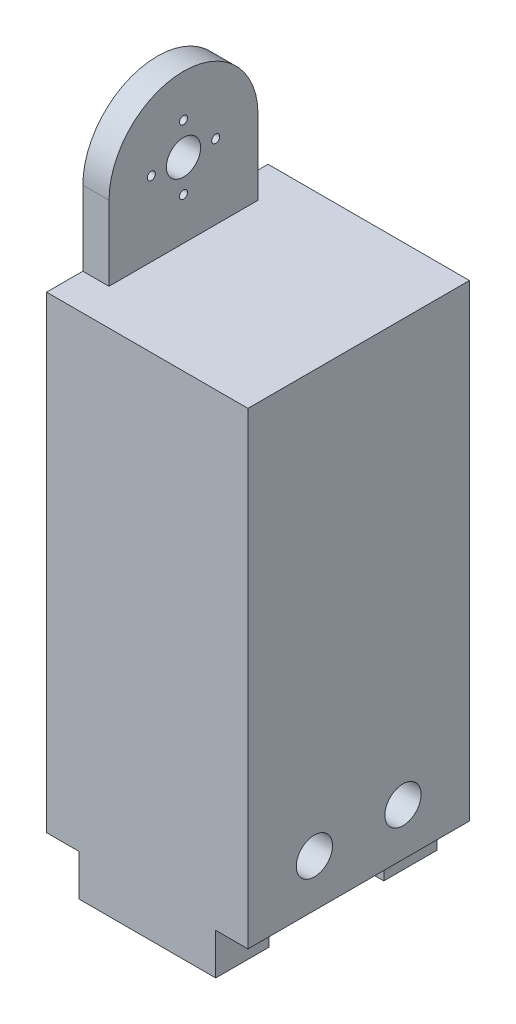
ISO-10303-21;
HEADER;
FILE_DESCRIPTION(('STEP AP214'),'2;1');
FILE_NAME('part.step','',(''),(''),'','','');
FILE_SCHEMA(('AUTOMOTIVE_DESIGN { 1 0 10303 214 1 1 1 1 }'));
ENDSEC;
DATA;
#1=APPLICATION_CONTEXT('core data for automotive mechanical design processes');
#2=APPLICATION_PROTOCOL_DEFINITION('international standard','automotive_design',2000,#1);
#3=PRODUCT_CONTEXT('',#1,'mechanical');
#4=PRODUCT('Part','Part','',(#3));
#5=PRODUCT_RELATED_PRODUCT_CATEGORY('part','',(#4));
#6=PRODUCT_DEFINITION_FORMATION('','',#4);
#7=PRODUCT_DEFINITION_CONTEXT('part definition',#1,'design');
#8=PRODUCT_DEFINITION('design','',#6,#7);
#9=PRODUCT_DEFINITION_SHAPE('','',#8);
#10=(LENGTH_UNIT() NAMED_UNIT(*) SI_UNIT(.MILLI.,.METRE.));
#11=(NAMED_UNIT(*) PLANE_ANGLE_UNIT() SI_UNIT($,.RADIAN.));
#12=(NAMED_UNIT(*) SI_UNIT($,.STERADIAN.) SOLID_ANGLE_UNIT());
#13=UNCERTAINTY_MEASURE_WITH_UNIT(LENGTH_MEASURE(1.E-05),#10,'distance_accuracy_value','');
#14=(GEOMETRIC_REPRESENTATION_CONTEXT(3) GLOBAL_UNCERTAINTY_ASSIGNED_CONTEXT((#13)) GLOBAL_UNIT_ASSIGNED_CONTEXT((#10,
#11,#12)) REPRESENTATION_CONTEXT('',''));
#15=CARTESIAN_POINT('',(0.,0.,0.));
#16=DIRECTION('',(0.,0.,1.));
#17=DIRECTION('',(1.,0.,0.));
#18=AXIS2_PLACEMENT_3D('',#15,#16,#17);
#19=CARTESIAN_POINT('',(-17.,-148.,-38.5));
#20=DIRECTION('',(-1.,0.,0.));
#21=DIRECTION('',(0.,1.,0.));
#22=AXIS2_PLACEMENT_3D('',#19,#20,#21);
#23=PLANE('',#22);
#24=CARTESIAN_POINT('',(-17.,-148.,-38.5));
#25=DIRECTION('',(1.,0.,0.));
#26=DIRECTION('',(0.,1.,0.));
#27=AXIS2_PLACEMENT_3D('',#24,#25,#26);
#28=CIRCLE('',#27,4.5);
#29=CARTESIAN_POINT('',(-17.,-151.112474899497,-41.75));
#30=VERTEX_POINT('',#29);
#31=CARTESIAN_POINT('',(-17.,-144.887525100503,-41.75));
#32=VERTEX_POINT('',#31);
#33=EDGE_CURVE('E1152',#30,#32,#28,.T.);
#34=ORIENTED_EDGE('',*,*,#33,.F.);
#35=DIRECTION('',(0.,1.,0.));
#36=VECTOR('',#35,1.);
#37=CARTESIAN_POINT('',(-17.,-169.75,-41.75));
#38=LINE('',#37,#36);
#39=EDGE_CURVE('E414',#30,#32,#38,.T.);
#40=ORIENTED_EDGE('',*,*,#39,.T.);
#41=EDGE_LOOP('',(#34,#40));
#42=FACE_BOUND('',#41,.T.);
#43=ADVANCED_FACE('F47',(#42),#23,.T.);
#44=CARTESIAN_POINT('',(-17.,-144.75,-41.6124748994972));
#45=VERTEX_POINT('',#44);
#46=CARTESIAN_POINT('',(-17.,-144.75,-35.3875251005028));
#47=VERTEX_POINT('',#46);
#48=EDGE_CURVE('E1153',#45,#47,#28,.T.);
#49=ORIENTED_EDGE('',*,*,#48,.F.);
#50=DIRECTION('',(0.,0.,1.));
#51=VECTOR('',#50,1.);
#52=CARTESIAN_POINT('',(-17.,-144.75,-55.));
#53=LINE('',#52,#51);
#54=EDGE_CURVE('E632',#45,#47,#53,.T.);
#55=ORIENTED_EDGE('',*,*,#54,.T.);
#56=EDGE_LOOP('',(#49,#55));
#57=FACE_BOUND('',#56,.T.);
#58=ADVANCED_FACE('F637',(#57),#23,.T.);
#59=CARTESIAN_POINT('',(-17.,-148.,-16.5));
#60=DIRECTION('',(-1.,0.,0.));
#61=DIRECTION('',(0.,1.,0.));
#62=AXIS2_PLACEMENT_3D('',#59,#60,#61);
#63=PLANE('',#62);
#64=CARTESIAN_POINT('',(-17.,-148.,-16.5));
#65=DIRECTION('',(1.,0.,0.));
#66=DIRECTION('',(0.,1.,0.));
#67=AXIS2_PLACEMENT_3D('',#64,#65,#66);
#68=CIRCLE('',#67,4.5);
#69=CARTESIAN_POINT('',(-17.,-144.75,-19.6124748994972));
#70=VERTEX_POINT('',#69);
#71=CARTESIAN_POINT('',(-17.,-144.75,-13.3875251005028));
#72=VERTEX_POINT('',#71);
#73=EDGE_CURVE('E463',#70,#72,#68,.T.);
#74=ORIENTED_EDGE('',*,*,#73,.F.);
#75=DIRECTION('',(0.,0.,1.));
#76=VECTOR('',#75,1.);
#77=CARTESIAN_POINT('',(-17.,-144.75,-55.));
#78=LINE('',#77,#76);
#79=EDGE_CURVE('E354',#70,#72,#78,.T.);
#80=ORIENTED_EDGE('',*,*,#79,.T.);
#81=EDGE_LOOP('',(#74,#80));
#82=FACE_BOUND('',#81,.T.);
#83=ADVANCED_FACE('F634',(#82),#63,.T.);
#84=CARTESIAN_POINT('',(-17.,-144.887525100503,-13.25));
#85=VERTEX_POINT('',#84);
#86=CARTESIAN_POINT('',(-17.,-151.112474899497,-13.25));
#87=VERTEX_POINT('',#86);
#88=EDGE_CURVE('E461',#85,#87,#68,.T.);
#89=ORIENTED_EDGE('',*,*,#88,.F.);
#90=DIRECTION('',(0.,1.,0.));
#91=VECTOR('',#90,1.);
#92=CARTESIAN_POINT('',(-17.,-169.75,-13.25));
#93=LINE('',#92,#91);
#94=EDGE_CURVE('E429',#87,#85,#93,.T.);
#95=ORIENTED_EDGE('',*,*,#94,.F.);
#96=EDGE_LOOP('',(#89,#95));
#97=FACE_BOUND('',#96,.T.);
#98=ADVANCED_FACE('F636',(#97),#63,.T.);
#99=CARTESIAN_POINT('',(17.,-148.,-38.5));
#100=DIRECTION('',(1.,0.,0.));
#101=DIRECTION('',(0.,1.,0.));
#102=AXIS2_PLACEMENT_3D('',#99,#100,#101);
#103=PLANE('',#102);
#104=DIRECTION('',(0.,1.,0.));
#105=VECTOR('',#104,1.);
#106=CARTESIAN_POINT('',(17.,-169.75,-41.75));
#107=LINE('',#106,#105);
#108=CARTESIAN_POINT('',(17.,-151.112474899497,-41.75));
#109=VERTEX_POINT('',#108);
#110=CARTESIAN_POINT('',(17.,-144.887525100503,-41.75));
#111=VERTEX_POINT('',#110);
#112=EDGE_CURVE('E407',#109,#111,#107,.T.);
#113=ORIENTED_EDGE('',*,*,#112,.F.);
#114=CARTESIAN_POINT('',(17.,-148.,-38.5));
#115=DIRECTION('',(1.,0.,0.));
#116=DIRECTION('',(0.,1.,0.));
#117=AXIS2_PLACEMENT_3D('',#114,#115,#116);
#118=CIRCLE('',#117,4.5);
#119=EDGE_CURVE('E253',#109,#111,#118,.T.);
#120=ORIENTED_EDGE('',*,*,#119,.T.);
#121=EDGE_LOOP('',(#113,#120));
#122=FACE_BOUND('',#121,.T.);
#123=ADVANCED_FACE('F578',(#122),#103,.T.);
#124=DIRECTION('',(0.,0.,1.));
#125=VECTOR('',#124,1.);
#126=CARTESIAN_POINT('',(17.,-144.75,-55.));
#127=LINE('',#126,#125);
#128=CARTESIAN_POINT('',(17.,-144.75,-41.6124748994972));
#129=VERTEX_POINT('',#128);
#130=CARTESIAN_POINT('',(17.,-144.75,-35.3875251005028));
#131=VERTEX_POINT('',#130);
#132=EDGE_CURVE('E240',#129,#131,#127,.T.);
#133=ORIENTED_EDGE('',*,*,#132,.F.);
#134=EDGE_CURVE('E250',#129,#131,#118,.T.);
#135=ORIENTED_EDGE('',*,*,#134,.T.);
#136=EDGE_LOOP('',(#133,#135));
#137=FACE_BOUND('',#136,.T.);
#138=ADVANCED_FACE('F259',(#137),#103,.T.);
#139=CARTESIAN_POINT('',(17.,-148.,-16.5));
#140=DIRECTION('',(1.,0.,0.));
#141=DIRECTION('',(0.,1.,0.));
#142=AXIS2_PLACEMENT_3D('',#139,#140,#141);
#143=PLANE('',#142);
#144=DIRECTION('',(0.,1.,0.));
#145=VECTOR('',#144,1.);
#146=CARTESIAN_POINT('',(17.,-169.75,-13.25));
#147=LINE('',#146,#145);
#148=CARTESIAN_POINT('',(17.,-151.112474899497,-13.25));
#149=VERTEX_POINT('',#148);
#150=CARTESIAN_POINT('',(17.,-144.887525100503,-13.25));
#151=VERTEX_POINT('',#150);
#152=EDGE_CURVE('E426',#149,#151,#147,.T.);
#153=ORIENTED_EDGE('',*,*,#152,.T.);
#154=CARTESIAN_POINT('',(17.,-148.,-16.5));
#155=DIRECTION('',(1.,0.,0.));
#156=DIRECTION('',(0.,1.,0.));
#157=AXIS2_PLACEMENT_3D('',#154,#155,#156);
#158=CIRCLE('',#157,4.5);
#159=EDGE_CURVE('E494',#151,#149,#158,.T.);
#160=ORIENTED_EDGE('',*,*,#159,.T.);
#161=EDGE_LOOP('',(#153,#160));
#162=FACE_BOUND('',#161,.T.);
#163=ADVANCED_FACE('F596',(#162),#143,.T.);
#164=DIRECTION('',(0.,0.,-1.));
#165=VECTOR('',#164,1.);
#166=CARTESIAN_POINT('',(17.,-144.75,-55.));
#167=LINE('',#166,#165);
#168=CARTESIAN_POINT('',(17.,-144.75,-13.3875251005028));
#169=VERTEX_POINT('',#168);
#170=CARTESIAN_POINT('',(17.,-144.75,-19.6124748994972));
#171=VERTEX_POINT('',#170);
#172=EDGE_CURVE('E361',#169,#171,#167,.T.);
#173=ORIENTED_EDGE('',*,*,#172,.T.);
#174=EDGE_CURVE('E495',#171,#169,#158,.T.);
#175=ORIENTED_EDGE('',*,*,#174,.T.);
#176=EDGE_LOOP('',(#173,#175));
#177=FACE_BOUND('',#176,.T.);
#178=ADVANCED_FACE('F654',(#177),#143,.T.);
#179=CARTESIAN_POINT('',(-18.5,0.,-55.));
#180=DIRECTION('',(-1.,0.,0.));
#181=DIRECTION('',(0.,-1.,0.));
#182=AXIS2_PLACEMENT_3D('',#179,#180,#181);
#183=PLANE('',#182);
#184=CARTESIAN_POINT('',(-18.5,-25.,-27.5));
#185=DIRECTION('',(1.,0.,0.));
#186=DIRECTION('',(0.,1.,0.));
#187=AXIS2_PLACEMENT_3D('',#184,#185,#186);
#188=CIRCLE('',#187,4.25);
#189=CARTESIAN_POINT('',(-18.5,-20.75,-27.5));
#190=VERTEX_POINT('',#189);
#191=EDGE_CURVE('E558',#190,#190,#188,.F.);
#192=ORIENTED_EDGE('',*,*,#191,.T.);
#193=EDGE_LOOP('',(#192));
#194=FACE_BOUND('',#193,.T.);
#195=CARTESIAN_POINT('',(-18.5,-24.9999999999999,-35.5000000000001));
#196=DIRECTION('',(1.,0.,0.));
#197=DIRECTION('',(0.,1.,0.));
#198=AXIS2_PLACEMENT_3D('',#195,#196,#197);
#199=CIRCLE('',#198,1.);
#200=CARTESIAN_POINT('',(-18.5,-23.9999999999999,-35.5000000000001));
#201=VERTEX_POINT('',#200);
#202=EDGE_CURVE('E554',#201,#201,#199,.F.);
#203=ORIENTED_EDGE('',*,*,#202,.T.);
#204=EDGE_LOOP('',(#203));
#205=FACE_BOUND('',#204,.T.);
#206=CARTESIAN_POINT('',(-18.5,-25.,-19.5000000000001));
#207=DIRECTION('',(1.,0.,0.));
#208=DIRECTION('',(0.,1.,0.));
#209=AXIS2_PLACEMENT_3D('',#206,#207,#208);
#210=CIRCLE('',#209,1.);
#211=CARTESIAN_POINT('',(-18.5,-24.,-19.5000000000001));
#212=VERTEX_POINT('',#211);
#213=EDGE_CURVE('E550',#212,#212,#210,.F.);
#214=ORIENTED_EDGE('',*,*,#213,.T.);
#215=EDGE_LOOP('',(#214));
#216=FACE_BOUND('',#215,.T.);
#217=CARTESIAN_POINT('',(-18.5,-33.,-27.5000000000002));
#218=DIRECTION('',(1.,0.,0.));
#219=DIRECTION('',(0.,1.,0.));
#220=AXIS2_PLACEMENT_3D('',#217,#218,#219);
#221=CIRCLE('',#220,1.);
#222=CARTESIAN_POINT('',(-18.5,-32.,-27.5000000000002));
#223=VERTEX_POINT('',#222);
#224=EDGE_CURVE('E546',#223,#223,#221,.F.);
#225=ORIENTED_EDGE('',*,*,#224,.T.);
#226=EDGE_LOOP('',(#225));
#227=FACE_BOUND('',#226,.T.);
#228=CARTESIAN_POINT('',(-18.5,-17.,-27.5));
#229=DIRECTION('',(1.,0.,0.));
#230=DIRECTION('',(0.,1.,0.));
#231=AXIS2_PLACEMENT_3D('',#228,#229,#230);
#232=CIRCLE('',#231,1.);
#233=CARTESIAN_POINT('',(-18.5,-16.,-27.5));
#234=VERTEX_POINT('',#233);
#235=EDGE_CURVE('E533',#234,#234,#232,.F.);
#236=ORIENTED_EDGE('',*,*,#235,.T.);
#237=EDGE_LOOP('',(#236));
#238=FACE_BOUND('',#237,.T.);
#239=DIRECTION('',(0.,-1.,0.));
#240=VECTOR('',#239,1.);
#241=CARTESIAN_POINT('',(-18.5,0.,-9.00000000000001));
#242=LINE('',#241,#240);
#243=CARTESIAN_POINT('',(-18.5,-25.,-9.00000000000001));
#244=VERTEX_POINT('',#243);
#245=CARTESIAN_POINT('',(-18.5,-43.5,-9.00000000000001));
#246=VERTEX_POINT('',#245);
#247=EDGE_CURVE('E506',#244,#246,#242,.T.);
#248=ORIENTED_EDGE('',*,*,#247,.T.);
#249=DIRECTION('',(0.,0.,1.));
#250=VECTOR('',#249,1.);
#251=CARTESIAN_POINT('',(-18.5,-43.5,-55.));
#252=LINE('',#251,#250);
#253=CARTESIAN_POINT('',(-18.5,-43.5,-46.));
#254=VERTEX_POINT('',#253);
#255=EDGE_CURVE('E317',#254,#246,#252,.T.);
#256=ORIENTED_EDGE('',*,*,#255,.F.);
#257=DIRECTION('',(0.,-1.,0.));
#258=VECTOR('',#257,1.);
#259=CARTESIAN_POINT('',(-18.5,0.,-46.));
#260=LINE('',#259,#258);
#261=CARTESIAN_POINT('',(-18.5,-25.,-46.));
#262=VERTEX_POINT('',#261);
#263=EDGE_CURVE('E522',#262,#254,#260,.T.);
#264=ORIENTED_EDGE('',*,*,#263,.F.);
#265=CARTESIAN_POINT('',(-18.5,-25.,-27.5));
#266=DIRECTION('',(1.,0.,0.));
#267=DIRECTION('',(0.,1.,0.));
#268=AXIS2_PLACEMENT_3D('',#265,#266,#267);
#269=CIRCLE('',#268,18.5);
#270=EDGE_CURVE('E501',#262,#244,#269,.T.);
#271=ORIENTED_EDGE('',*,*,#270,.T.);
#272=EDGE_LOOP('',(#248,#256,#264,#271));
#273=FACE_BOUND('',#272,.T.);
#274=ADVANCED_FACE('F700',(#194,#205,#216,#227,#238,#273),#183,.F.);
#275=CARTESIAN_POINT('',(0.,0.,-55.));
#276=DIRECTION('',(0.,0.,1.));
#277=DIRECTION('',(1.,0.,0.));
#278=AXIS2_PLACEMENT_3D('',#275,#276,#277);
#279=PLANE('',#278);
#280=DIRECTION('',(0.,-1.,0.));
#281=VECTOR('',#280,1.);
#282=CARTESIAN_POINT('',(-25.,0.,-55.));
#283=LINE('',#282,#281);
#284=CARTESIAN_POINT('',(-25.,-43.5,-55.));
#285=VERTEX_POINT('',#284);
#286=CARTESIAN_POINT('',(-25.,-159.75,-55.));
#287=VERTEX_POINT('',#286);
#288=EDGE_CURVE('E57',#285,#287,#283,.T.);
#289=ORIENTED_EDGE('',*,*,#288,.F.);
#290=DIRECTION('',(-1.,0.,0.));
#291=VECTOR('',#290,1.);
#292=CARTESIAN_POINT('',(0.,-43.5,-55.));
#293=LINE('',#292,#291);
#294=CARTESIAN_POINT('',(25.,-43.5,-55.));
#295=VERTEX_POINT('',#294);
#296=EDGE_CURVE('E325',#295,#285,#293,.T.);
#297=ORIENTED_EDGE('',*,*,#296,.F.);
#298=DIRECTION('',(0.,1.,0.));
#299=VECTOR('',#298,1.);
#300=CARTESIAN_POINT('',(25.,0.,-55.));
#301=LINE('',#300,#299);
#302=CARTESIAN_POINT('',(25.,-159.75,-55.));
#303=VERTEX_POINT('',#302);
#304=EDGE_CURVE('E11',#303,#295,#301,.T.);
#305=ORIENTED_EDGE('',*,*,#304,.F.);
#306=DIRECTION('',(1.,0.,0.));
#307=VECTOR('',#306,1.);
#308=CARTESIAN_POINT('',(17.,-159.75,-55.));
#309=LINE('',#308,#307);
#310=CARTESIAN_POINT('',(17.,-159.75,-55.));
#311=VERTEX_POINT('',#310);
#312=EDGE_CURVE('E402',#311,#303,#309,.T.);
#313=ORIENTED_EDGE('',*,*,#312,.F.);
#314=DIRECTION('',(0.,1.,0.));
#315=VECTOR('',#314,1.);
#316=CARTESIAN_POINT('',(17.,-169.75,-55.));
#317=LINE('',#316,#315);
#318=CARTESIAN_POINT('',(17.,-170.,-55.));
#319=VERTEX_POINT('',#318);
#320=EDGE_CURVE('E390',#319,#311,#317,.T.);
#321=ORIENTED_EDGE('',*,*,#320,.F.);
#322=DIRECTION('',(1.,0.,0.));
#323=VECTOR('',#322,1.);
#324=CARTESIAN_POINT('',(0.,-170.,-55.));
#325=LINE('',#324,#323);
#326=CARTESIAN_POINT('',(-17.,-170.,-55.));
#327=VERTEX_POINT('',#326);
#328=EDGE_CURVE('E316',#327,#319,#325,.T.);
#329=ORIENTED_EDGE('',*,*,#328,.F.);
#330=DIRECTION('',(0.,1.,0.));
#331=VECTOR('',#330,1.);
#332=CARTESIAN_POINT('',(-17.,-169.75,-55.));
#333=LINE('',#332,#331);
#334=CARTESIAN_POINT('',(-17.,-159.75,-55.));
#335=VERTEX_POINT('',#334);
#336=EDGE_CURVE('E366',#327,#335,#333,.T.);
#337=ORIENTED_EDGE('',*,*,#336,.T.);
#338=DIRECTION('',(-1.,0.,0.));
#339=VECTOR('',#338,1.);
#340=CARTESIAN_POINT('',(-17.,-159.75,-55.));
#341=LINE('',#340,#339);
#342=EDGE_CURVE('E383',#335,#287,#341,.T.);
#343=ORIENTED_EDGE('',*,*,#342,.T.);
#344=EDGE_LOOP('',(#289,#297,#305,#313,#321,#329,#337,#343));
#345=FACE_BOUND('',#344,.T.);
#346=ADVANCED_FACE('F697',(#345),#279,.F.);
#347=CARTESIAN_POINT('',(0.,0.,0.));
#348=DIRECTION('',(0.,0.,1.));
#349=DIRECTION('',(1.,0.,0.));
#350=AXIS2_PLACEMENT_3D('',#347,#348,#349);
#351=PLANE('',#350);
#352=DIRECTION('',(-1.,0.,0.));
#353=VECTOR('',#352,1.);
#354=CARTESIAN_POINT('',(0.,-43.5,0.));
#355=LINE('',#354,#353);
#356=CARTESIAN_POINT('',(25.,-43.5,0.));
#357=VERTEX_POINT('',#356);
#358=CARTESIAN_POINT('',(-25.,-43.5,0.));
#359=VERTEX_POINT('',#358);
#360=EDGE_CURVE('E300',#357,#359,#355,.T.);
#361=ORIENTED_EDGE('',*,*,#360,.T.);
#362=DIRECTION('',(0.,-1.,0.));
#363=VECTOR('',#362,1.);
#364=CARTESIAN_POINT('',(-25.,0.,0.));
#365=LINE('',#364,#363);
#366=CARTESIAN_POINT('',(-25.,-159.75,0.));
#367=VERTEX_POINT('',#366);
#368=EDGE_CURVE('E292',#359,#367,#365,.T.);
#369=ORIENTED_EDGE('',*,*,#368,.T.);
#370=DIRECTION('',(-1.,0.,0.));
#371=VECTOR('',#370,1.);
#372=CARTESIAN_POINT('',(-17.,-159.75,0.));
#373=LINE('',#372,#371);
#374=CARTESIAN_POINT('',(-17.,-159.75,0.));
#375=VERTEX_POINT('',#374);
#376=EDGE_CURVE('E378',#375,#367,#373,.T.);
#377=ORIENTED_EDGE('',*,*,#376,.F.);
#378=DIRECTION('',(0.,-1.,0.));
#379=VECTOR('',#378,1.);
#380=CARTESIAN_POINT('',(-17.,-169.75,0.));
#381=LINE('',#380,#379);
#382=CARTESIAN_POINT('',(-17.,-170.,0.));
#383=VERTEX_POINT('',#382);
#384=EDGE_CURVE('E370',#375,#383,#381,.T.);
#385=ORIENTED_EDGE('',*,*,#384,.T.);
#386=DIRECTION('',(1.,0.,0.));
#387=VECTOR('',#386,1.);
#388=CARTESIAN_POINT('',(0.,-170.,0.));
#389=LINE('',#388,#387);
#390=CARTESIAN_POINT('',(17.,-170.,0.));
#391=VERTEX_POINT('',#390);
#392=EDGE_CURVE('E338',#383,#391,#389,.T.);
#393=ORIENTED_EDGE('',*,*,#392,.T.);
#394=DIRECTION('',(0.,-1.,0.));
#395=VECTOR('',#394,1.);
#396=CARTESIAN_POINT('',(17.,-169.75,0.));
#397=LINE('',#396,#395);
#398=CARTESIAN_POINT('',(17.,-159.75,0.));
#399=VERTEX_POINT('',#398);
#400=EDGE_CURVE('E398',#399,#391,#397,.T.);
#401=ORIENTED_EDGE('',*,*,#400,.F.);
#402=DIRECTION('',(1.,0.,0.));
#403=VECTOR('',#402,1.);
#404=CARTESIAN_POINT('',(17.,-159.75,0.));
#405=LINE('',#404,#403);
#406=CARTESIAN_POINT('',(25.,-159.75,0.));
#407=VERTEX_POINT('',#406);
#408=EDGE_CURVE('E304',#399,#407,#405,.T.);
#409=ORIENTED_EDGE('',*,*,#408,.T.);
#410=DIRECTION('',(0.,1.,0.));
#411=VECTOR('',#410,1.);
#412=CARTESIAN_POINT('',(25.,0.,0.));
#413=LINE('',#412,#411);
#414=EDGE_CURVE('E290',#407,#357,#413,.T.);
#415=ORIENTED_EDGE('',*,*,#414,.T.);
#416=EDGE_LOOP('',(#361,#369,#377,#385,#393,#401,#409,#415));
#417=FACE_BOUND('',#416,.T.);
#418=ADVANCED_FACE('F299',(#417),#351,.T.);
#419=CARTESIAN_POINT('',(25.,0.,-55.));
#420=DIRECTION('',(1.,0.,0.));
#421=DIRECTION('',(0.,1.,0.));
#422=AXIS2_PLACEMENT_3D('',#419,#420,#421);
#423=PLANE('',#422);
#424=ORIENTED_EDGE('',*,*,#304,.T.);
#425=DIRECTION('',(0.,0.,1.));
#426=VECTOR('',#425,1.);
#427=CARTESIAN_POINT('',(25.,-43.5,-55.));
#428=LINE('',#427,#426);
#429=EDGE_CURVE('E312',#295,#357,#428,.T.);
#430=ORIENTED_EDGE('',*,*,#429,.T.);
#431=ORIENTED_EDGE('',*,*,#414,.F.);
#432=DIRECTION('',(0.,0.,1.));
#433=VECTOR('',#432,1.);
#434=CARTESIAN_POINT('',(25.,-159.75,-55.));
#435=LINE('',#434,#433);
#436=EDGE_CURVE('E310',#303,#407,#435,.T.);
#437=ORIENTED_EDGE('',*,*,#436,.F.);
#438=EDGE_LOOP('',(#424,#430,#431,#437));
#439=FACE_BOUND('',#438,.T.);
#440=CARTESIAN_POINT('',(25.,-148.,-16.5));
#441=DIRECTION('',(1.,0.,0.));
#442=DIRECTION('',(0.,1.,0.));
#443=AXIS2_PLACEMENT_3D('',#440,#441,#442);
#444=CIRCLE('',#443,4.5);
#445=CARTESIAN_POINT('',(25.,-143.5,-16.5));
#446=VERTEX_POINT('',#445);
#447=EDGE_CURVE('E488',#446,#446,#444,.T.);
#448=ORIENTED_EDGE('',*,*,#447,.F.);
#449=EDGE_LOOP('',(#448));
#450=FACE_BOUND('',#449,.T.);
#451=CARTESIAN_POINT('',(25.,-148.,-38.5));
#452=DIRECTION('',(1.,0.,0.));
#453=DIRECTION('',(0.,1.,0.));
#454=AXIS2_PLACEMENT_3D('',#451,#452,#453);
#455=CIRCLE('',#454,4.5);
#456=CARTESIAN_POINT('',(25.,-143.5,-38.5));
#457=VERTEX_POINT('',#456);
#458=EDGE_CURVE('E255',#457,#457,#455,.T.);
#459=ORIENTED_EDGE('',*,*,#458,.F.);
#460=EDGE_LOOP('',(#459));
#461=FACE_BOUND('',#460,.T.);
#462=ADVANCED_FACE('F308',(#439,#450,#461),#423,.T.);
#463=CARTESIAN_POINT('',(-17.,0.,-55.));
#464=DIRECTION('',(1.,0.,0.));
#465=DIRECTION('',(0.,1.,0.));
#466=AXIS2_PLACEMENT_3D('',#463,#464,#465);
#467=PLANE('',#466);
#468=EDGE_CURVE('E268',#47,#70,#53,.T.);
#469=ORIENTED_EDGE('',*,*,#468,.T.);
#470=EDGE_CURVE('E467',#87,#70,#68,.T.);
#471=ORIENTED_EDGE('',*,*,#470,.F.);
#472=CARTESIAN_POINT('',(-17.,-159.75,-13.25));
#473=VERTEX_POINT('',#472);
#474=EDGE_CURVE('E433',#473,#87,#93,.T.);
#475=ORIENTED_EDGE('',*,*,#474,.F.);
#476=DIRECTION('',(0.,0.,1.));
#477=VECTOR('',#476,1.);
#478=CARTESIAN_POINT('',(-17.,-159.75,-55.));
#479=LINE('',#478,#477);
#480=CARTESIAN_POINT('',(-17.,-159.75,-41.75));
#481=VERTEX_POINT('',#480);
#482=EDGE_CURVE('E379',#481,#473,#479,.T.);
#483=ORIENTED_EDGE('',*,*,#482,.F.);
#484=EDGE_CURVE('E73',#481,#30,#38,.T.);
#485=ORIENTED_EDGE('',*,*,#484,.T.);
#486=EDGE_CURVE('E478',#47,#30,#28,.T.);
#487=ORIENTED_EDGE('',*,*,#486,.F.);
#488=EDGE_LOOP('',(#469,#471,#475,#483,#485,#487));
#489=FACE_BOUND('',#488,.T.);
#490=ADVANCED_FACE('F626',(#489),#467,.T.);
#491=CARTESIAN_POINT('',(-25.,0.,-55.));
#492=DIRECTION('',(-1.,0.,0.));
#493=DIRECTION('',(0.,-1.,0.));
#494=AXIS2_PLACEMENT_3D('',#491,#492,#493);
#495=PLANE('',#494);
#496=DIRECTION('',(0.,0.,-1.));
#497=VECTOR('',#496,1.);
#498=CARTESIAN_POINT('',(-25.,-43.5,0.));
#499=LINE('',#498,#497);
#500=CARTESIAN_POINT('',(-25.,-43.5,-9.00000000000001));
#501=VERTEX_POINT('',#500);
#502=EDGE_CURVE('E514',#359,#501,#499,.T.);
#503=ORIENTED_EDGE('',*,*,#502,.T.);
#504=DIRECTION('',(0.,-1.,0.));
#505=VECTOR('',#504,1.);
#506=CARTESIAN_POINT('',(-25.,0.,-9.00000000000001));
#507=LINE('',#506,#505);
#508=CARTESIAN_POINT('',(-25.,-25.,-9.00000000000001));
#509=VERTEX_POINT('',#508);
#510=EDGE_CURVE('E515',#509,#501,#507,.T.);
#511=ORIENTED_EDGE('',*,*,#510,.F.);
#512=CARTESIAN_POINT('',(-25.,-25.,-27.5));
#513=DIRECTION('',(1.,0.,0.));
#514=DIRECTION('',(0.,1.,0.));
#515=AXIS2_PLACEMENT_3D('',#512,#513,#514);
#516=CIRCLE('',#515,18.5);
#517=CARTESIAN_POINT('',(-25.,-25.,-46.));
#518=VERTEX_POINT('',#517);
#519=EDGE_CURVE('E502',#518,#509,#516,.T.);
#520=ORIENTED_EDGE('',*,*,#519,.F.);
#521=DIRECTION('',(0.,-1.,0.));
#522=VECTOR('',#521,1.);
#523=CARTESIAN_POINT('',(-25.,0.,-46.));
#524=LINE('',#523,#522);
#525=CARTESIAN_POINT('',(-25.,-43.5,-46.));
#526=VERTEX_POINT('',#525);
#527=EDGE_CURVE('E505',#518,#526,#524,.T.);
#528=ORIENTED_EDGE('',*,*,#527,.T.);
#529=EDGE_CURVE('E510',#526,#285,#499,.T.);
#530=ORIENTED_EDGE('',*,*,#529,.T.);
#531=ORIENTED_EDGE('',*,*,#288,.T.);
#532=DIRECTION('',(0.,0.,1.));
#533=VECTOR('',#532,1.);
#534=CARTESIAN_POINT('',(-25.,-159.75,-55.));
#535=LINE('',#534,#533);
#536=EDGE_CURVE('E365',#287,#367,#535,.T.);
#537=ORIENTED_EDGE('',*,*,#536,.T.);
#538=ORIENTED_EDGE('',*,*,#368,.F.);
#539=EDGE_LOOP('',(#503,#511,#520,#528,#530,#531,#537,#538));
#540=FACE_BOUND('',#539,.T.);
#541=CARTESIAN_POINT('',(-25.,-17.,-27.5));
#542=DIRECTION('',(-1.,0.,0.));
#543=DIRECTION('',(0.,-1.,0.));
#544=AXIS2_PLACEMENT_3D('',#541,#542,#543);
#545=CIRCLE('',#544,1.);
#546=CARTESIAN_POINT('',(-25.,-18.,-27.5));
#547=VERTEX_POINT('',#546);
#548=EDGE_CURVE('E285',#547,#547,#545,.T.);
#549=ORIENTED_EDGE('',*,*,#548,.F.);
#550=EDGE_LOOP('',(#549));
#551=FACE_BOUND('',#550,.T.);
#552=CARTESIAN_POINT('',(-25.,-25.,-27.5));
#553=DIRECTION('',(-1.,0.,0.));
#554=DIRECTION('',(0.,-1.,0.));
#555=AXIS2_PLACEMENT_3D('',#552,#553,#554);
#556=CIRCLE('',#555,4.25);
#557=CARTESIAN_POINT('',(-25.,-29.25,-27.5));
#558=VERTEX_POINT('',#557);
#559=EDGE_CURVE('E51',#558,#558,#556,.T.);
#560=ORIENTED_EDGE('',*,*,#559,.F.);
#561=EDGE_LOOP('',(#560));
#562=FACE_BOUND('',#561,.T.);
#563=CARTESIAN_POINT('',(-25.,-24.9999999999999,-35.5000000000001));
#564=DIRECTION('',(-1.,0.,0.));
#565=DIRECTION('',(0.,-1.,0.));
#566=AXIS2_PLACEMENT_3D('',#563,#564,#565);
#567=CIRCLE('',#566,1.);
#568=CARTESIAN_POINT('',(-25.,-25.9999999999999,-35.5000000000001));
#569=VERTEX_POINT('',#568);
#570=EDGE_CURVE('E281',#569,#569,#567,.T.);
#571=ORIENTED_EDGE('',*,*,#570,.F.);
#572=EDGE_LOOP('',(#571));
#573=FACE_BOUND('',#572,.T.);
#574=CARTESIAN_POINT('',(-25.,-33.,-27.5000000000002));
#575=DIRECTION('',(-1.,0.,0.));
#576=DIRECTION('',(0.,-1.,0.));
#577=AXIS2_PLACEMENT_3D('',#574,#575,#576);
#578=CIRCLE('',#577,1.);
#579=CARTESIAN_POINT('',(-25.,-34.,-27.5000000000002));
#580=VERTEX_POINT('',#579);
#581=EDGE_CURVE('E277',#580,#580,#578,.T.);
#582=ORIENTED_EDGE('',*,*,#581,.F.);
#583=EDGE_LOOP('',(#582));
#584=FACE_BOUND('',#583,.T.);
#585=CARTESIAN_POINT('',(-25.,-25.,-19.5000000000001));
#586=DIRECTION('',(-1.,0.,0.));
#587=DIRECTION('',(0.,-1.,0.));
#588=AXIS2_PLACEMENT_3D('',#585,#586,#587);
#589=CIRCLE('',#588,1.);
#590=CARTESIAN_POINT('',(-25.,-26.,-19.5000000000001));
#591=VERTEX_POINT('',#590);
#592=EDGE_CURVE('E273',#591,#591,#589,.T.);
#593=ORIENTED_EDGE('',*,*,#592,.F.);
#594=EDGE_LOOP('',(#593));
#595=FACE_BOUND('',#594,.T.);
#596=CARTESIAN_POINT('',(-25.,-148.,-16.5));
#597=DIRECTION('',(1.,0.,0.));
#598=DIRECTION('',(0.,1.,0.));
#599=AXIS2_PLACEMENT_3D('',#596,#597,#598);
#600=CIRCLE('',#599,4.5);
#601=CARTESIAN_POINT('',(-25.,-143.5,-16.5));
#602=VERTEX_POINT('',#601);
#603=EDGE_CURVE('E471',#602,#602,#600,.T.);
#604=ORIENTED_EDGE('',*,*,#603,.T.);
#605=EDGE_LOOP('',(#604));
#606=FACE_BOUND('',#605,.T.);
#607=CARTESIAN_POINT('',(-25.,-148.,-38.5));
#608=DIRECTION('',(1.,0.,0.));
#609=DIRECTION('',(0.,1.,0.));
#610=AXIS2_PLACEMENT_3D('',#607,#608,#609);
#611=CIRCLE('',#610,4.5);
#612=CARTESIAN_POINT('',(-25.,-143.5,-38.5));
#613=VERTEX_POINT('',#612);
#614=EDGE_CURVE('E1160',#613,#613,#611,.T.);
#615=ORIENTED_EDGE('',*,*,#614,.T.);
#616=EDGE_LOOP('',(#615));
#617=FACE_BOUND('',#616,.T.);
#618=ADVANCED_FACE('F49',(#540,#551,#562,#573,#584,#595,#606,#617),#495,.T.);
#619=CARTESIAN_POINT('',(0.,-144.75,-55.));
#620=DIRECTION('',(0.,1.,0.));
#621=DIRECTION('',(0.,0.,1.));
#622=AXIS2_PLACEMENT_3D('',#619,#620,#621);
#623=PLANE('',#622);
#624=DIRECTION('',(-1.,0.,0.));
#625=VECTOR('',#624,1.);
#626=CARTESIAN_POINT('',(-17.,-144.75,-41.75));
#627=LINE('',#626,#625);
#628=CARTESIAN_POINT('',(17.,-144.75,-41.75));
#629=VERTEX_POINT('',#628);
#630=CARTESIAN_POINT('',(-17.,-144.75,-41.75));
#631=VERTEX_POINT('',#630);
#632=EDGE_CURVE('E419',#629,#631,#627,.T.);
#633=ORIENTED_EDGE('',*,*,#632,.F.);
#634=EDGE_CURVE('E243',#629,#129,#127,.T.);
#635=ORIENTED_EDGE('',*,*,#634,.T.);
#636=ORIENTED_EDGE('',*,*,#132,.T.);
#637=EDGE_CURVE('E226',#131,#171,#127,.T.);
#638=ORIENTED_EDGE('',*,*,#637,.T.);
#639=ORIENTED_EDGE('',*,*,#172,.F.);
#640=CARTESIAN_POINT('',(17.,-144.75,-13.25));
#641=VERTEX_POINT('',#640);
#642=EDGE_CURVE('E362',#641,#169,#167,.T.);
#643=ORIENTED_EDGE('',*,*,#642,.F.);
#644=DIRECTION('',(1.,0.,0.));
#645=VECTOR('',#644,1.);
#646=CARTESIAN_POINT('',(-17.,-144.75,-13.25));
#647=LINE('',#646,#645);
#648=CARTESIAN_POINT('',(-17.,-144.75,-13.25));
#649=VERTEX_POINT('',#648);
#650=EDGE_CURVE('E422',#649,#641,#647,.T.);
#651=ORIENTED_EDGE('',*,*,#650,.F.);
#652=DIRECTION('',(0.,0.,1.));
#653=VECTOR('',#652,1.);
#654=CARTESIAN_POINT('',(-17.,-144.75,-55.));
#655=LINE('',#654,#653);
#656=EDGE_CURVE('E263',#72,#649,#655,.T.);
#657=ORIENTED_EDGE('',*,*,#656,.F.);
#658=ORIENTED_EDGE('',*,*,#79,.F.);
#659=ORIENTED_EDGE('',*,*,#468,.F.);
#660=ORIENTED_EDGE('',*,*,#54,.F.);
#661=EDGE_CURVE('E271',#631,#45,#53,.T.);
#662=ORIENTED_EDGE('',*,*,#661,.F.);
#663=EDGE_LOOP('',(#633,#635,#636,#638,#639,#643,#651,#657,#658,#659,#660,#662));
#664=FACE_BOUND('',#663,.T.);
#665=ADVANCED_FACE('F265',(#664),#623,.F.);
#666=CARTESIAN_POINT('',(17.,0.,-55.));
#667=DIRECTION('',(1.,0.,0.));
#668=DIRECTION('',(0.,0.,-1.));
#669=AXIS2_PLACEMENT_3D('',#666,#667,#668);
#670=PLANE('',#669);
#671=CARTESIAN_POINT('',(17.,-159.75,-13.25));
#672=VERTEX_POINT('',#671);
#673=EDGE_CURVE('E430',#672,#149,#147,.T.);
#674=ORIENTED_EDGE('',*,*,#673,.T.);
#675=EDGE_CURVE('E233',#149,#171,#158,.T.);
#676=ORIENTED_EDGE('',*,*,#675,.T.);
#677=ORIENTED_EDGE('',*,*,#637,.F.);
#678=EDGE_CURVE('E230',#131,#109,#118,.T.);
#679=ORIENTED_EDGE('',*,*,#678,.T.);
#680=CARTESIAN_POINT('',(17.,-159.75,-41.75));
#681=VERTEX_POINT('',#680);
#682=EDGE_CURVE('E415',#681,#109,#107,.T.);
#683=ORIENTED_EDGE('',*,*,#682,.F.);
#684=DIRECTION('',(0.,0.,1.));
#685=VECTOR('',#684,1.);
#686=CARTESIAN_POINT('',(17.,-159.75,-55.));
#687=LINE('',#686,#685);
#688=EDGE_CURVE('E399',#681,#672,#687,.T.);
#689=ORIENTED_EDGE('',*,*,#688,.T.);
#690=EDGE_LOOP('',(#674,#676,#677,#679,#683,#689));
#691=FACE_BOUND('',#690,.T.);
#692=ADVANCED_FACE('F228',(#691),#670,.F.);
#693=CARTESIAN_POINT('',(-30.,-25.,-19.5000000000001));
#694=DIRECTION('',(1.,0.,0.));
#695=DIRECTION('',(0.,1.,0.));
#696=AXIS2_PLACEMENT_3D('',#693,#694,#695);
#697=CYLINDRICAL_SURFACE('',#696,1.);
#698=ORIENTED_EDGE('',*,*,#592,.T.);
#699=EDGE_LOOP('',(#698));
#700=FACE_BOUND('',#699,.T.);
#701=ORIENTED_EDGE('',*,*,#213,.F.);
#702=EDGE_LOOP('',(#701));
#703=FACE_BOUND('',#702,.T.);
#704=ADVANCED_FACE('F678',(#700,#703),#697,.F.);
#705=CARTESIAN_POINT('',(-30.,-33.,-27.5000000000002));
#706=DIRECTION('',(1.,0.,0.));
#707=DIRECTION('',(0.,1.,0.));
#708=AXIS2_PLACEMENT_3D('',#705,#706,#707);
#709=CYLINDRICAL_SURFACE('',#708,1.);
#710=ORIENTED_EDGE('',*,*,#581,.T.);
#711=EDGE_LOOP('',(#710));
#712=FACE_BOUND('',#711,.T.);
#713=ORIENTED_EDGE('',*,*,#224,.F.);
#714=EDGE_LOOP('',(#713));
#715=FACE_BOUND('',#714,.T.);
#716=ADVANCED_FACE('F686',(#712,#715),#709,.F.);
#717=CARTESIAN_POINT('',(-30.,-24.9999999999999,-35.5000000000001));
#718=DIRECTION('',(1.,0.,0.));
#719=DIRECTION('',(0.,1.,0.));
#720=AXIS2_PLACEMENT_3D('',#717,#718,#719);
#721=CYLINDRICAL_SURFACE('',#720,1.);
#722=ORIENTED_EDGE('',*,*,#570,.T.);
#723=EDGE_LOOP('',(#722));
#724=FACE_BOUND('',#723,.T.);
#725=ORIENTED_EDGE('',*,*,#202,.F.);
#726=EDGE_LOOP('',(#725));
#727=FACE_BOUND('',#726,.T.);
#728=ADVANCED_FACE('F682',(#724,#727),#721,.F.);
#729=CARTESIAN_POINT('',(-30.,-17.,-27.5));
#730=DIRECTION('',(1.,0.,0.));
#731=DIRECTION('',(0.,1.,0.));
#732=AXIS2_PLACEMENT_3D('',#729,#730,#731);
#733=CYLINDRICAL_SURFACE('',#732,1.);
#734=ORIENTED_EDGE('',*,*,#548,.T.);
#735=EDGE_LOOP('',(#734));
#736=FACE_BOUND('',#735,.T.);
#737=ORIENTED_EDGE('',*,*,#235,.F.);
#738=EDGE_LOOP('',(#737));
#739=FACE_BOUND('',#738,.T.);
#740=ADVANCED_FACE('F679',(#736,#739),#733,.F.);
#741=CARTESIAN_POINT('',(-30.,-25.,-27.5));
#742=DIRECTION('',(1.,0.,0.));
#743=DIRECTION('',(0.,1.,0.));
#744=AXIS2_PLACEMENT_3D('',#741,#742,#743);
#745=CYLINDRICAL_SURFACE('',#744,4.25);
#746=ORIENTED_EDGE('',*,*,#559,.T.);
#747=EDGE_LOOP('',(#746));
#748=FACE_BOUND('',#747,.T.);
#749=ORIENTED_EDGE('',*,*,#191,.F.);
#750=EDGE_LOOP('',(#749));
#751=FACE_BOUND('',#750,.T.);
#752=ADVANCED_FACE('F671',(#748,#751),#745,.F.);
#753=CARTESIAN_POINT('',(-17.,-169.75,-13.25));
#754=DIRECTION('',(0.,0.,1.));
#755=DIRECTION('',(1.,0.,0.));
#756=AXIS2_PLACEMENT_3D('',#753,#754,#755);
#757=PLANE('',#756);
#758=ORIENTED_EDGE('',*,*,#650,.T.);
#759=DIRECTION('',(0.,1.,0.));
#760=VECTOR('',#759,1.);
#761=CARTESIAN_POINT('',(17.,-169.75,-13.25));
#762=LINE('',#761,#760);
#763=EDGE_CURVE('E493',#151,#641,#762,.T.);
#764=ORIENTED_EDGE('',*,*,#763,.F.);
#765=ORIENTED_EDGE('',*,*,#152,.F.);
#766=ORIENTED_EDGE('',*,*,#673,.F.);
#767=CARTESIAN_POINT('',(17.,-170.,-13.25));
#768=VERTEX_POINT('',#767);
#769=EDGE_CURVE('E427',#768,#672,#147,.T.);
#770=ORIENTED_EDGE('',*,*,#769,.F.);
#771=DIRECTION('',(1.,0.,0.));
#772=VECTOR('',#771,1.);
#773=CARTESIAN_POINT('',(0.,-170.,-13.25));
#774=LINE('',#773,#772);
#775=CARTESIAN_POINT('',(-17.,-170.,-13.25));
#776=VERTEX_POINT('',#775);
#777=EDGE_CURVE('E342',#776,#768,#774,.T.);
#778=ORIENTED_EDGE('',*,*,#777,.F.);
#779=EDGE_CURVE('E241',#776,#473,#93,.T.);
#780=ORIENTED_EDGE('',*,*,#779,.T.);
#781=ORIENTED_EDGE('',*,*,#474,.T.);
#782=ORIENTED_EDGE('',*,*,#94,.T.);
#783=DIRECTION('',(0.,-1.,0.));
#784=VECTOR('',#783,1.);
#785=CARTESIAN_POINT('',(-17.,-169.75,-13.25));
#786=LINE('',#785,#784);
#787=EDGE_CURVE('E442',#649,#85,#786,.T.);
#788=ORIENTED_EDGE('',*,*,#787,.F.);
#789=EDGE_LOOP('',(#758,#764,#765,#766,#770,#778,#780,#781,#782,#788));
#790=FACE_BOUND('',#789,.T.);
#791=ADVANCED_FACE('F441',(#790),#757,.F.);
#792=CARTESIAN_POINT('',(-17.,-169.75,-41.75));
#793=DIRECTION('',(0.,0.,-1.));
#794=DIRECTION('',(-1.,0.,0.));
#795=AXIS2_PLACEMENT_3D('',#792,#793,#794);
#796=PLANE('',#795);
#797=ORIENTED_EDGE('',*,*,#632,.T.);
#798=DIRECTION('',(0.,1.,0.));
#799=VECTOR('',#798,1.);
#800=CARTESIAN_POINT('',(-17.,-169.75,-41.75));
#801=LINE('',#800,#799);
#802=EDGE_CURVE('E65',#32,#631,#801,.T.);
#803=ORIENTED_EDGE('',*,*,#802,.F.);
#804=ORIENTED_EDGE('',*,*,#39,.F.);
#805=ORIENTED_EDGE('',*,*,#484,.F.);
#806=CARTESIAN_POINT('',(-17.,-170.,-41.75));
#807=VERTEX_POINT('',#806);
#808=EDGE_CURVE('E416',#807,#481,#38,.T.);
#809=ORIENTED_EDGE('',*,*,#808,.F.);
#810=DIRECTION('',(1.,0.,0.));
#811=VECTOR('',#810,1.);
#812=CARTESIAN_POINT('',(0.,-170.,-41.75));
#813=LINE('',#812,#811);
#814=CARTESIAN_POINT('',(17.,-170.,-41.75));
#815=VERTEX_POINT('',#814);
#816=EDGE_CURVE('E322',#807,#815,#813,.T.);
#817=ORIENTED_EDGE('',*,*,#816,.T.);
#818=EDGE_CURVE('E410',#815,#681,#107,.T.);
#819=ORIENTED_EDGE('',*,*,#818,.T.);
#820=ORIENTED_EDGE('',*,*,#682,.T.);
#821=ORIENTED_EDGE('',*,*,#112,.T.);
#822=DIRECTION('',(0.,-1.,0.));
#823=VECTOR('',#822,1.);
#824=CARTESIAN_POINT('',(17.,-169.75,-41.75));
#825=LINE('',#824,#823);
#826=EDGE_CURVE('E484',#629,#111,#825,.T.);
#827=ORIENTED_EDGE('',*,*,#826,.F.);
#828=EDGE_LOOP('',(#797,#803,#804,#805,#809,#817,#819,#820,#821,#827));
#829=FACE_BOUND('',#828,.T.);
#830=ADVANCED_FACE('F579',(#829),#796,.F.);
#831=CARTESIAN_POINT('',(17.,0.,0.));
#832=DIRECTION('',(1.,0.,0.));
#833=DIRECTION('',(0.,1.,0.));
#834=AXIS2_PLACEMENT_3D('',#831,#832,#833);
#835=PLANE('',#834);
#836=ORIENTED_EDGE('',*,*,#769,.T.);
#837=EDGE_CURVE('E394',#672,#399,#687,.T.);
#838=ORIENTED_EDGE('',*,*,#837,.T.);
#839=ORIENTED_EDGE('',*,*,#400,.T.);
#840=DIRECTION('',(0.,0.,1.));
#841=VECTOR('',#840,1.);
#842=CARTESIAN_POINT('',(17.,-170.,-13.25));
#843=LINE('',#842,#841);
#844=EDGE_CURVE('E350',#768,#391,#843,.T.);
#845=ORIENTED_EDGE('',*,*,#844,.F.);
#846=EDGE_LOOP('',(#836,#838,#839,#845));
#847=FACE_BOUND('',#846,.T.);
#848=ADVANCED_FACE('F610',(#847),#835,.T.);
#849=ORIENTED_EDGE('',*,*,#818,.F.);
#850=DIRECTION('',(0.,0.,-1.));
#851=VECTOR('',#850,1.);
#852=CARTESIAN_POINT('',(17.,-170.,-41.75));
#853=LINE('',#852,#851);
#854=EDGE_CURVE('E332',#815,#319,#853,.T.);
#855=ORIENTED_EDGE('',*,*,#854,.T.);
#856=ORIENTED_EDGE('',*,*,#320,.T.);
#857=EDGE_CURVE('E395',#311,#681,#687,.T.);
#858=ORIENTED_EDGE('',*,*,#857,.T.);
#859=EDGE_LOOP('',(#849,#855,#856,#858));
#860=FACE_BOUND('',#859,.T.);
#861=ADVANCED_FACE('F664',(#860),#835,.T.);
#862=CARTESIAN_POINT('',(17.,-159.75,-55.));
#863=DIRECTION('',(0.,1.,0.));
#864=DIRECTION('',(-1.,0.,0.));
#865=AXIS2_PLACEMENT_3D('',#862,#863,#864);
#866=PLANE('',#865);
#867=ORIENTED_EDGE('',*,*,#436,.T.);
#868=ORIENTED_EDGE('',*,*,#408,.F.);
#869=ORIENTED_EDGE('',*,*,#837,.F.);
#870=ORIENTED_EDGE('',*,*,#688,.F.);
#871=ORIENTED_EDGE('',*,*,#857,.F.);
#872=ORIENTED_EDGE('',*,*,#312,.T.);
#873=EDGE_LOOP('',(#867,#868,#869,#870,#871,#872));
#874=FACE_BOUND('',#873,.T.);
#875=ADVANCED_FACE('F613',(#874),#866,.F.);
#876=CARTESIAN_POINT('',(-17.,0.,0.));
#877=DIRECTION('',(-1.,0.,0.));
#878=DIRECTION('',(0.,1.,0.));
#879=AXIS2_PLACEMENT_3D('',#876,#877,#878);
#880=PLANE('',#879);
#881=ORIENTED_EDGE('',*,*,#779,.F.);
#882=DIRECTION('',(0.,0.,1.));
#883=VECTOR('',#882,1.);
#884=CARTESIAN_POINT('',(-17.,-170.,-13.25));
#885=LINE('',#884,#883);
#886=EDGE_CURVE('E346',#776,#383,#885,.T.);
#887=ORIENTED_EDGE('',*,*,#886,.T.);
#888=ORIENTED_EDGE('',*,*,#384,.F.);
#889=EDGE_CURVE('E373',#473,#375,#479,.T.);
#890=ORIENTED_EDGE('',*,*,#889,.F.);
#891=EDGE_LOOP('',(#881,#887,#888,#890));
#892=FACE_BOUND('',#891,.T.);
#893=ADVANCED_FACE('F621',(#892),#880,.T.);
#894=ORIENTED_EDGE('',*,*,#808,.T.);
#895=EDGE_CURVE('E374',#335,#481,#479,.T.);
#896=ORIENTED_EDGE('',*,*,#895,.F.);
#897=ORIENTED_EDGE('',*,*,#336,.F.);
#898=DIRECTION('',(0.,0.,-1.));
#899=VECTOR('',#898,1.);
#900=CARTESIAN_POINT('',(-17.,-170.,-41.75));
#901=LINE('',#900,#899);
#902=EDGE_CURVE('E334',#807,#327,#901,.T.);
#903=ORIENTED_EDGE('',*,*,#902,.F.);
#904=EDGE_LOOP('',(#894,#896,#897,#903));
#905=FACE_BOUND('',#904,.T.);
#906=ADVANCED_FACE('F659',(#905),#880,.T.);
#907=CARTESIAN_POINT('',(-17.,-159.75,-55.));
#908=DIRECTION('',(0.,-1.,0.));
#909=DIRECTION('',(1.,0.,0.));
#910=AXIS2_PLACEMENT_3D('',#907,#908,#909);
#911=PLANE('',#910);
#912=ORIENTED_EDGE('',*,*,#536,.F.);
#913=ORIENTED_EDGE('',*,*,#342,.F.);
#914=ORIENTED_EDGE('',*,*,#895,.T.);
#915=ORIENTED_EDGE('',*,*,#482,.T.);
#916=ORIENTED_EDGE('',*,*,#889,.T.);
#917=ORIENTED_EDGE('',*,*,#376,.T.);
#918=EDGE_LOOP('',(#912,#913,#914,#915,#916,#917));
#919=FACE_BOUND('',#918,.T.);
#920=ADVANCED_FACE('F624',(#919),#911,.T.);
#921=CARTESIAN_POINT('',(0.,-170.,-13.25));
#922=DIRECTION('',(0.,-1.,0.));
#923=DIRECTION('',(0.,0.,-1.));
#924=AXIS2_PLACEMENT_3D('',#921,#922,#923);
#925=PLANE('',#924);
#926=ORIENTED_EDGE('',*,*,#392,.F.);
#927=ORIENTED_EDGE('',*,*,#886,.F.);
#928=ORIENTED_EDGE('',*,*,#777,.T.);
#929=ORIENTED_EDGE('',*,*,#844,.T.);
#930=EDGE_LOOP('',(#926,#927,#928,#929));
#931=FACE_BOUND('',#930,.T.);
#932=ADVANCED_FACE('F619',(#931),#925,.T.);
#933=CARTESIAN_POINT('',(0.,-170.,-41.75));
#934=DIRECTION('',(0.,1.,0.));
#935=DIRECTION('',(0.,0.,1.));
#936=AXIS2_PLACEMENT_3D('',#933,#934,#935);
#937=PLANE('',#936);
#938=ORIENTED_EDGE('',*,*,#328,.T.);
#939=ORIENTED_EDGE('',*,*,#854,.F.);
#940=ORIENTED_EDGE('',*,*,#816,.F.);
#941=ORIENTED_EDGE('',*,*,#902,.T.);
#942=EDGE_LOOP('',(#938,#939,#940,#941));
#943=FACE_BOUND('',#942,.T.);
#944=ADVANCED_FACE('F834',(#943),#937,.F.);
#945=CARTESIAN_POINT('',(0.,-43.5,-55.));
#946=DIRECTION('',(0.,1.,0.));
#947=DIRECTION('',(-1.,0.,0.));
#948=AXIS2_PLACEMENT_3D('',#945,#946,#947);
#949=PLANE('',#948);
#950=ORIENTED_EDGE('',*,*,#360,.F.);
#951=ORIENTED_EDGE('',*,*,#429,.F.);
#952=ORIENTED_EDGE('',*,*,#296,.T.);
#953=ORIENTED_EDGE('',*,*,#529,.F.);
#954=DIRECTION('',(1.,0.,0.));
#955=VECTOR('',#954,1.);
#956=CARTESIAN_POINT('',(-25.,-43.5,-46.));
#957=LINE('',#956,#955);
#958=EDGE_CURVE('E537',#526,#254,#957,.T.);
#959=ORIENTED_EDGE('',*,*,#958,.T.);
#960=ORIENTED_EDGE('',*,*,#255,.T.);
#961=DIRECTION('',(1.,0.,0.));
#962=VECTOR('',#961,1.);
#963=CARTESIAN_POINT('',(-25.,-43.5,-9.00000000000001));
#964=LINE('',#963,#962);
#965=EDGE_CURVE('E534',#501,#246,#964,.T.);
#966=ORIENTED_EDGE('',*,*,#965,.F.);
#967=ORIENTED_EDGE('',*,*,#502,.F.);
#968=EDGE_LOOP('',(#950,#951,#952,#953,#959,#960,#966,#967));
#969=FACE_BOUND('',#968,.T.);
#970=ADVANCED_FACE('F830',(#969),#949,.T.);
#971=CARTESIAN_POINT('',(-25.,-25.,-27.5));
#972=DIRECTION('',(1.,0.,0.));
#973=DIRECTION('',(0.,1.,0.));
#974=AXIS2_PLACEMENT_3D('',#971,#972,#973);
#975=CYLINDRICAL_SURFACE('',#974,18.5);
#976=ORIENTED_EDGE('',*,*,#270,.F.);
#977=DIRECTION('',(1.,0.,0.));
#978=VECTOR('',#977,1.);
#979=CARTESIAN_POINT('',(-25.,-25.,-46.));
#980=LINE('',#979,#978);
#981=EDGE_CURVE('E518',#518,#262,#980,.T.);
#982=ORIENTED_EDGE('',*,*,#981,.F.);
#983=ORIENTED_EDGE('',*,*,#519,.T.);
#984=DIRECTION('',(1.,0.,0.));
#985=VECTOR('',#984,1.);
#986=CARTESIAN_POINT('',(-25.,-25.,-9.00000000000001));
#987=LINE('',#986,#985);
#988=EDGE_CURVE('E529',#509,#244,#987,.T.);
#989=ORIENTED_EDGE('',*,*,#988,.T.);
#990=EDGE_LOOP('',(#976,#982,#983,#989));
#991=FACE_BOUND('',#990,.T.);
#992=ADVANCED_FACE('F823',(#991),#975,.T.);
#993=CARTESIAN_POINT('',(-25.,0.,-9.00000000000001));
#994=DIRECTION('',(0.,0.,1.));
#995=DIRECTION('',(1.,0.,0.));
#996=AXIS2_PLACEMENT_3D('',#993,#994,#995);
#997=PLANE('',#996);
#998=ORIENTED_EDGE('',*,*,#247,.F.);
#999=ORIENTED_EDGE('',*,*,#988,.F.);
#1000=ORIENTED_EDGE('',*,*,#510,.T.);
#1001=ORIENTED_EDGE('',*,*,#965,.T.);
#1002=EDGE_LOOP('',(#998,#999,#1000,#1001));
#1003=FACE_BOUND('',#1002,.T.);
#1004=ADVANCED_FACE('F820',(#1003),#997,.T.);
#1005=CARTESIAN_POINT('',(-25.,0.,-46.));
#1006=DIRECTION('',(0.,0.,1.));
#1007=DIRECTION('',(1.,0.,0.));
#1008=AXIS2_PLACEMENT_3D('',#1005,#1006,#1007);
#1009=PLANE('',#1008);
#1010=ORIENTED_EDGE('',*,*,#263,.T.);
#1011=ORIENTED_EDGE('',*,*,#958,.F.);
#1012=ORIENTED_EDGE('',*,*,#527,.F.);
#1013=ORIENTED_EDGE('',*,*,#981,.T.);
#1014=EDGE_LOOP('',(#1010,#1011,#1012,#1013));
#1015=FACE_BOUND('',#1014,.T.);
#1016=ADVANCED_FACE('F721',(#1015),#1009,.F.);
#1017=CARTESIAN_POINT('',(17.,-148.,-16.5));
#1018=DIRECTION('',(1.,0.,0.));
#1019=DIRECTION('',(0.,1.,0.));
#1020=AXIS2_PLACEMENT_3D('',#1017,#1018,#1019);
#1021=PLANE('',#1020);
#1022=ORIENTED_EDGE('',*,*,#763,.T.);
#1023=ORIENTED_EDGE('',*,*,#642,.T.);
#1024=EDGE_CURVE('E489',#169,#151,#158,.T.);
#1025=ORIENTED_EDGE('',*,*,#1024,.T.);
#1026=EDGE_LOOP('',(#1022,#1023,#1025));
#1027=FACE_BOUND('',#1026,.T.);
#1028=ADVANCED_FACE('F600',(#1027),#1021,.F.);
#1029=CARTESIAN_POINT('',(17.,-148.,-16.5));
#1030=DIRECTION('',(1.,0.,0.));
#1031=DIRECTION('',(0.,1.,0.));
#1032=AXIS2_PLACEMENT_3D('',#1029,#1030,#1031);
#1033=CYLINDRICAL_SURFACE('',#1032,4.5);
#1034=ORIENTED_EDGE('',*,*,#1024,.F.);
#1035=ORIENTED_EDGE('',*,*,#174,.F.);
#1036=ORIENTED_EDGE('',*,*,#675,.F.);
#1037=ORIENTED_EDGE('',*,*,#159,.F.);
#1038=EDGE_LOOP('',(#1034,#1035,#1036,#1037));
#1039=FACE_BOUND('',#1038,.T.);
#1040=ORIENTED_EDGE('',*,*,#447,.T.);
#1041=EDGE_LOOP('',(#1040));
#1042=FACE_BOUND('',#1041,.T.);
#1043=ADVANCED_FACE('F593',(#1039,#1042),#1033,.F.);
#1044=CARTESIAN_POINT('',(17.,-148.,-38.5));
#1045=DIRECTION('',(1.,0.,0.));
#1046=DIRECTION('',(0.,1.,0.));
#1047=AXIS2_PLACEMENT_3D('',#1044,#1045,#1046);
#1048=PLANE('',#1047);
#1049=EDGE_CURVE('E262',#111,#129,#118,.T.);
#1050=ORIENTED_EDGE('',*,*,#1049,.T.);
#1051=ORIENTED_EDGE('',*,*,#634,.F.);
#1052=ORIENTED_EDGE('',*,*,#826,.T.);
#1053=EDGE_LOOP('',(#1050,#1051,#1052));
#1054=FACE_BOUND('',#1053,.T.);
#1055=ADVANCED_FACE('F574',(#1054),#1048,.F.);
#1056=CARTESIAN_POINT('',(17.,-148.,-38.5));
#1057=DIRECTION('',(1.,0.,0.));
#1058=DIRECTION('',(0.,1.,0.));
#1059=AXIS2_PLACEMENT_3D('',#1056,#1057,#1058);
#1060=CYLINDRICAL_SURFACE('',#1059,4.5);
#1061=ORIENTED_EDGE('',*,*,#678,.F.);
#1062=ORIENTED_EDGE('',*,*,#134,.F.);
#1063=ORIENTED_EDGE('',*,*,#1049,.F.);
#1064=ORIENTED_EDGE('',*,*,#119,.F.);
#1065=EDGE_LOOP('',(#1061,#1062,#1063,#1064));
#1066=FACE_BOUND('',#1065,.T.);
#1067=ORIENTED_EDGE('',*,*,#458,.T.);
#1068=EDGE_LOOP('',(#1067));
#1069=FACE_BOUND('',#1068,.T.);
#1070=ADVANCED_FACE('F247',(#1066,#1069),#1060,.F.);
#1071=CARTESIAN_POINT('',(-17.,-148.,-16.5));
#1072=DIRECTION('',(-1.,0.,0.));
#1073=DIRECTION('',(0.,1.,0.));
#1074=AXIS2_PLACEMENT_3D('',#1071,#1072,#1073);
#1075=PLANE('',#1074);
#1076=EDGE_CURVE('E452',#72,#85,#68,.T.);
#1077=ORIENTED_EDGE('',*,*,#1076,.F.);
#1078=ORIENTED_EDGE('',*,*,#656,.T.);
#1079=ORIENTED_EDGE('',*,*,#787,.T.);
#1080=EDGE_LOOP('',(#1077,#1078,#1079));
#1081=FACE_BOUND('',#1080,.T.);
#1082=ADVANCED_FACE('F451',(#1081),#1075,.F.);
#1083=CARTESIAN_POINT('',(-17.,-148.,-16.5));
#1084=DIRECTION('',(-1.,0.,0.));
#1085=DIRECTION('',(0.,-1.,0.));
#1086=AXIS2_PLACEMENT_3D('',#1083,#1084,#1085);
#1087=CYLINDRICAL_SURFACE('',#1086,4.5);
#1088=ORIENTED_EDGE('',*,*,#1076,.T.);
#1089=ORIENTED_EDGE('',*,*,#88,.T.);
#1090=ORIENTED_EDGE('',*,*,#470,.T.);
#1091=ORIENTED_EDGE('',*,*,#73,.T.);
#1092=EDGE_LOOP('',(#1088,#1089,#1090,#1091));
#1093=FACE_BOUND('',#1092,.T.);
#1094=ORIENTED_EDGE('',*,*,#603,.F.);
#1095=EDGE_LOOP('',(#1094));
#1096=FACE_BOUND('',#1095,.T.);
#1097=ADVANCED_FACE('F458',(#1093,#1096),#1087,.F.);
#1098=CARTESIAN_POINT('',(-17.,-148.,-38.5));
#1099=DIRECTION('',(-1.,0.,0.));
#1100=DIRECTION('',(0.,1.,0.));
#1101=AXIS2_PLACEMENT_3D('',#1098,#1099,#1100);
#1102=PLANE('',#1101);
#1103=ORIENTED_EDGE('',*,*,#802,.T.);
#1104=ORIENTED_EDGE('',*,*,#661,.T.);
#1105=EDGE_CURVE('E1157',#32,#45,#28,.T.);
#1106=ORIENTED_EDGE('',*,*,#1105,.F.);
#1107=EDGE_LOOP('',(#1103,#1104,#1106));
#1108=FACE_BOUND('',#1107,.T.);
#1109=ADVANCED_FACE('F796',(#1108),#1102,.F.);
#1110=CARTESIAN_POINT('',(-17.,-148.,-38.5));
#1111=DIRECTION('',(-1.,0.,0.));
#1112=DIRECTION('',(0.,-1.,0.));
#1113=AXIS2_PLACEMENT_3D('',#1110,#1111,#1112);
#1114=CYLINDRICAL_SURFACE('',#1113,4.5);
#1115=ORIENTED_EDGE('',*,*,#486,.T.);
#1116=ORIENTED_EDGE('',*,*,#33,.T.);
#1117=ORIENTED_EDGE('',*,*,#1105,.T.);
#1118=ORIENTED_EDGE('',*,*,#48,.T.);
#1119=EDGE_LOOP('',(#1115,#1116,#1117,#1118));
#1120=FACE_BOUND('',#1119,.T.);
#1121=ORIENTED_EDGE('',*,*,#614,.F.);
#1122=EDGE_LOOP('',(#1121));
#1123=FACE_BOUND('',#1122,.T.);
#1124=ADVANCED_FACE('F805',(#1120,#1123),#1114,.F.);
#1125=CLOSED_SHELL('',(#43,#58,#83,#98,#123,#138,#163,#178,#274,#346,#418,#462,#490,#618,#665,
#692,#704,#716,#728,#740,#752,#791,#830,#848,#861,#875,#893,#906,#920,#932,#944,#970,#992,#1004,
#1016,#1028,#1043,#1055,#1070,#1082,#1097,#1109,#1124));
#1126=MANIFOLD_SOLID_BREP('B2',#1125);
#1127=ADVANCED_BREP_SHAPE_REPRESENTATION('',(#18,#1126),#14);
#1128=SHAPE_DEFINITION_REPRESENTATION(#9,#1127);
ENDSEC;
END-ISO-10303-21;
